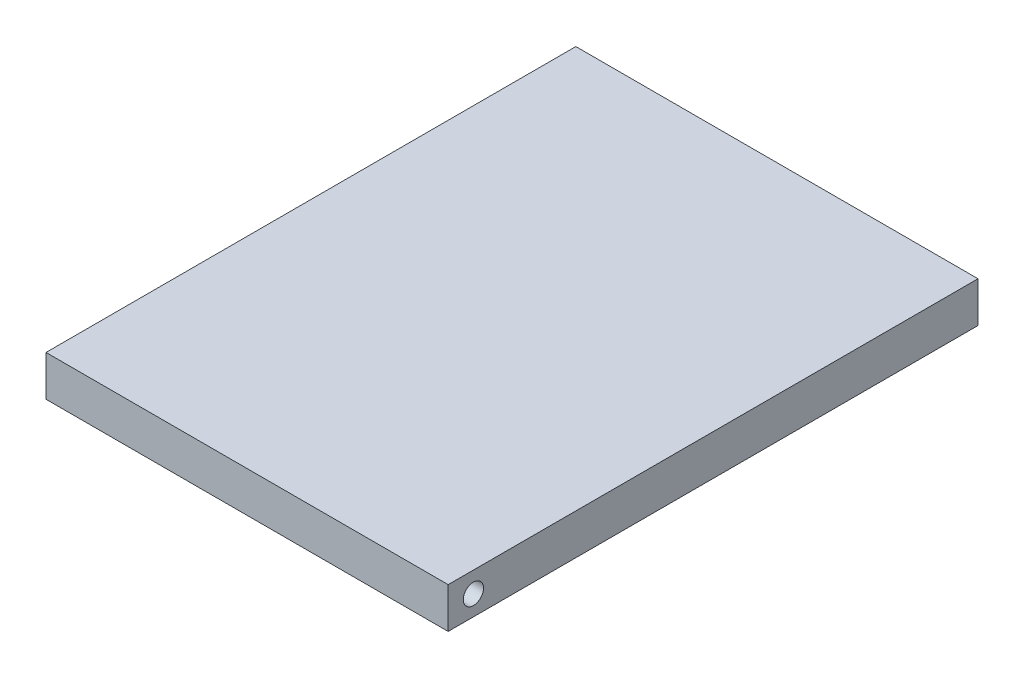
ISO-10303-21;
HEADER;
FILE_DESCRIPTION(('STEP AP214'),'2;1');
FILE_NAME('part.step','',(''),(''),'','','');
FILE_SCHEMA(('AUTOMOTIVE_DESIGN { 1 0 10303 214 1 1 1 1 }'));
ENDSEC;
DATA;
#1=APPLICATION_CONTEXT('core data for automotive mechanical design processes');
#2=APPLICATION_PROTOCOL_DEFINITION('international standard','automotive_design',2000,#1);
#3=PRODUCT_CONTEXT('',#1,'mechanical');
#4=PRODUCT('Part','Part','',(#3));
#5=PRODUCT_RELATED_PRODUCT_CATEGORY('part','',(#4));
#6=PRODUCT_DEFINITION_FORMATION('','',#4);
#7=PRODUCT_DEFINITION_CONTEXT('part definition',#1,'design');
#8=PRODUCT_DEFINITION('design','',#6,#7);
#9=PRODUCT_DEFINITION_SHAPE('','',#8);
#10=(LENGTH_UNIT() NAMED_UNIT(*) SI_UNIT(.MILLI.,.METRE.));
#11=(NAMED_UNIT(*) PLANE_ANGLE_UNIT() SI_UNIT($,.RADIAN.));
#12=(NAMED_UNIT(*) SI_UNIT($,.STERADIAN.) SOLID_ANGLE_UNIT());
#13=UNCERTAINTY_MEASURE_WITH_UNIT(LENGTH_MEASURE(1.E-05),#10,'distance_accuracy_value','');
#14=(GEOMETRIC_REPRESENTATION_CONTEXT(3) GLOBAL_UNCERTAINTY_ASSIGNED_CONTEXT((#13)) GLOBAL_UNIT_ASSIGNED_CONTEXT((#10,
#11,#12)) REPRESENTATION_CONTEXT('',''));
#15=CARTESIAN_POINT('',(0.,0.,0.));
#16=DIRECTION('',(0.,0.,1.));
#17=DIRECTION('',(1.,0.,0.));
#18=AXIS2_PLACEMENT_3D('',#15,#16,#17);
#19=CARTESIAN_POINT('',(14.87381282528,3.,-19.5956581666387));
#20=DIRECTION('',(0.,0.,1.));
#21=DIRECTION('',(1.,0.,0.));
#22=AXIS2_PLACEMENT_3D('',#19,#20,#21);
#23=PLANE('',#22);
#24=DIRECTION('',(-1.,0.,0.));
#25=VECTOR('',#24,1.);
#26=CARTESIAN_POINT('',(14.87381282528,0.,-19.5956581666387));
#27=LINE('',#26,#25);
#28=CARTESIAN_POINT('',(14.87381282528,0.,-19.5956581666387));
#29=VERTEX_POINT('',#28);
#30=CARTESIAN_POINT('',(-14.87381282528,0.,-19.5956581666387));
#31=VERTEX_POINT('',#30);
#32=EDGE_CURVE('E105',#29,#31,#27,.T.);
#33=ORIENTED_EDGE('',*,*,#32,.T.);
#34=DIRECTION('',(0.,-1.,0.));
#35=VECTOR('',#34,1.);
#36=CARTESIAN_POINT('',(-14.87381282528,3.,-19.5956581666387));
#37=LINE('',#36,#35);
#38=CARTESIAN_POINT('',(-14.87381282528,3.,-19.5956581666387));
#39=VERTEX_POINT('',#38);
#40=EDGE_CURVE('E11',#39,#31,#37,.T.);
#41=ORIENTED_EDGE('',*,*,#40,.F.);
#42=DIRECTION('',(-1.,0.,0.));
#43=VECTOR('',#42,1.);
#44=CARTESIAN_POINT('',(14.87381282528,3.,-19.5956581666387));
#45=LINE('',#44,#43);
#46=CARTESIAN_POINT('',(14.87381282528,3.,-19.5956581666387));
#47=VERTEX_POINT('',#46);
#48=EDGE_CURVE('E78',#47,#39,#45,.T.);
#49=ORIENTED_EDGE('',*,*,#48,.F.);
#50=DIRECTION('',(0.,-1.,0.));
#51=VECTOR('',#50,1.);
#52=CARTESIAN_POINT('',(14.87381282528,3.,-19.5956581666387));
#53=LINE('',#52,#51);
#54=EDGE_CURVE('E101',#47,#29,#53,.T.);
#55=ORIENTED_EDGE('',*,*,#54,.T.);
#56=EDGE_LOOP('',(#33,#41,#49,#55));
#57=FACE_BOUND('',#56,.T.);
#58=ADVANCED_FACE('F38',(#57),#23,.F.);
#59=CARTESIAN_POINT('',(-14.87381282528,3.,19.5956581666387));
#60=DIRECTION('',(-1.,0.,0.));
#61=DIRECTION('',(0.,0.,1.));
#62=AXIS2_PLACEMENT_3D('',#59,#60,#61);
#63=PLANE('',#62);
#64=DIRECTION('',(0.,0.,-1.));
#65=VECTOR('',#64,1.);
#66=CARTESIAN_POINT('',(-14.87381282528,0.,19.5956581666387));
#67=LINE('',#66,#65);
#68=CARTESIAN_POINT('',(-14.87381282528,0.,19.5956581666387));
#69=VERTEX_POINT('',#68);
#70=EDGE_CURVE('E87',#69,#31,#67,.T.);
#71=ORIENTED_EDGE('',*,*,#70,.F.);
#72=DIRECTION('',(0.,-1.,0.));
#73=VECTOR('',#72,1.);
#74=CARTESIAN_POINT('',(-14.87381282528,3.,19.5956581666387));
#75=LINE('',#74,#73);
#76=CARTESIAN_POINT('',(-14.87381282528,3.,19.5956581666387));
#77=VERTEX_POINT('',#76);
#78=EDGE_CURVE('E47',#77,#69,#75,.T.);
#79=ORIENTED_EDGE('',*,*,#78,.F.);
#80=DIRECTION('',(0.,0.,-1.));
#81=VECTOR('',#80,1.);
#82=CARTESIAN_POINT('',(-14.87381282528,3.,19.5956581666387));
#83=LINE('',#82,#81);
#84=EDGE_CURVE('E85',#77,#39,#83,.T.);
#85=ORIENTED_EDGE('',*,*,#84,.T.);
#86=ORIENTED_EDGE('',*,*,#40,.T.);
#87=EDGE_LOOP('',(#71,#79,#85,#86));
#88=FACE_BOUND('',#87,.T.);
#89=ADVANCED_FACE('F84',(#88),#63,.T.);
#90=CARTESIAN_POINT('',(14.87381282528,3.,19.5956581666387));
#91=DIRECTION('',(0.,0.,1.));
#92=DIRECTION('',(1.,0.,0.));
#93=AXIS2_PLACEMENT_3D('',#90,#91,#92);
#94=PLANE('',#93);
#95=DIRECTION('',(-1.,0.,0.));
#96=VECTOR('',#95,1.);
#97=CARTESIAN_POINT('',(14.87381282528,0.,19.5956581666387));
#98=LINE('',#97,#96);
#99=CARTESIAN_POINT('',(14.87381282528,0.,19.5956581666387));
#100=VERTEX_POINT('',#99);
#101=EDGE_CURVE('E112',#100,#69,#98,.T.);
#102=ORIENTED_EDGE('',*,*,#101,.F.);
#103=DIRECTION('',(0.,-1.,0.));
#104=VECTOR('',#103,1.);
#105=CARTESIAN_POINT('',(14.87381282528,3.,19.5956581666387));
#106=LINE('',#105,#104);
#107=CARTESIAN_POINT('',(14.87381282528,3.,19.5956581666387));
#108=VERTEX_POINT('',#107);
#109=EDGE_CURVE('E70',#108,#100,#106,.T.);
#110=ORIENTED_EDGE('',*,*,#109,.F.);
#111=DIRECTION('',(-1.,0.,0.));
#112=VECTOR('',#111,1.);
#113=CARTESIAN_POINT('',(14.87381282528,3.,19.5956581666387));
#114=LINE('',#113,#112);
#115=EDGE_CURVE('E94',#108,#77,#114,.T.);
#116=ORIENTED_EDGE('',*,*,#115,.T.);
#117=ORIENTED_EDGE('',*,*,#78,.T.);
#118=EDGE_LOOP('',(#102,#110,#116,#117));
#119=FACE_BOUND('',#118,.T.);
#120=ADVANCED_FACE('F97',(#119),#94,.T.);
#121=CARTESIAN_POINT('',(14.87381282528,3.,19.5956581666387));
#122=DIRECTION('',(-1.,0.,0.));
#123=DIRECTION('',(0.,0.,1.));
#124=AXIS2_PLACEMENT_3D('',#121,#122,#123);
#125=PLANE('',#124);
#126=CARTESIAN_POINT('',(14.87381282528,1.47679927875149,17.7277636986124));
#127=DIRECTION('',(1.,0.,0.));
#128=DIRECTION('',(0.,0.,-1.));
#129=AXIS2_PLACEMENT_3D('',#126,#127,#128);
#130=CIRCLE('',#129,0.750000000000002);
#131=CARTESIAN_POINT('',(14.87381282528,1.47679927875149,16.9777636986124));
#132=VERTEX_POINT('',#131);
#133=EDGE_CURVE('E152',#132,#132,#130,.T.);
#134=ORIENTED_EDGE('',*,*,#133,.F.);
#135=EDGE_LOOP('',(#134));
#136=FACE_BOUND('',#135,.T.);
#137=DIRECTION('',(0.,0.,-1.));
#138=VECTOR('',#137,1.);
#139=CARTESIAN_POINT('',(14.87381282528,0.,19.5956581666387));
#140=LINE('',#139,#138);
#141=EDGE_CURVE('E73',#100,#29,#140,.T.);
#142=ORIENTED_EDGE('',*,*,#141,.T.);
#143=ORIENTED_EDGE('',*,*,#54,.F.);
#144=DIRECTION('',(0.,0.,-1.));
#145=VECTOR('',#144,1.);
#146=CARTESIAN_POINT('',(14.87381282528,3.,19.5956581666387));
#147=LINE('',#146,#145);
#148=EDGE_CURVE('E55',#108,#47,#147,.T.);
#149=ORIENTED_EDGE('',*,*,#148,.F.);
#150=ORIENTED_EDGE('',*,*,#109,.T.);
#151=EDGE_LOOP('',(#142,#143,#149,#150));
#152=FACE_BOUND('',#151,.T.);
#153=ADVANCED_FACE('F134',(#136,#152),#125,.F.);
#154=CARTESIAN_POINT('',(0.,3.,0.));
#155=DIRECTION('',(0.,-1.,0.));
#156=DIRECTION('',(0.,0.,-1.));
#157=AXIS2_PLACEMENT_3D('',#154,#155,#156);
#158=PLANE('',#157);
#159=ORIENTED_EDGE('',*,*,#48,.T.);
#160=ORIENTED_EDGE('',*,*,#84,.F.);
#161=ORIENTED_EDGE('',*,*,#115,.F.);
#162=ORIENTED_EDGE('',*,*,#148,.T.);
#163=EDGE_LOOP('',(#159,#160,#161,#162));
#164=FACE_BOUND('',#163,.T.);
#165=ADVANCED_FACE('F93',(#164),#158,.F.);
#166=CARTESIAN_POINT('',(0.,0.,0.));
#167=DIRECTION('',(0.,-1.,0.));
#168=DIRECTION('',(0.,0.,-1.));
#169=AXIS2_PLACEMENT_3D('',#166,#167,#168);
#170=PLANE('',#169);
#171=ORIENTED_EDGE('',*,*,#32,.F.);
#172=ORIENTED_EDGE('',*,*,#141,.F.);
#173=ORIENTED_EDGE('',*,*,#101,.T.);
#174=ORIENTED_EDGE('',*,*,#70,.T.);
#175=EDGE_LOOP('',(#171,#172,#173,#174));
#176=FACE_BOUND('',#175,.T.);
#177=ADVANCED_FACE('F123',(#176),#170,.T.);
#178=CARTESIAN_POINT('',(1.87381282528,1.47679927875149,17.7277636986124));
#179=DIRECTION('',(1.,0.,0.));
#180=DIRECTION('',(0.,0.,-1.));
#181=AXIS2_PLACEMENT_3D('',#178,#179,#180);
#182=CYLINDRICAL_SURFACE('',#181,0.750000000000002);
#183=CARTESIAN_POINT('',(1.87381282528,1.47679927875149,17.7277636986124));
#184=DIRECTION('',(1.,0.,0.));
#185=DIRECTION('',(0.,0.,-1.));
#186=AXIS2_PLACEMENT_3D('',#183,#184,#185);
#187=CIRCLE('',#186,0.750000000000002);
#188=CARTESIAN_POINT('',(1.87381282528,1.47679927875149,16.9777636986124));
#189=VERTEX_POINT('',#188);
#190=EDGE_CURVE('E109',#189,#189,#187,.T.);
#191=ORIENTED_EDGE('',*,*,#190,.F.);
#192=EDGE_LOOP('',(#191));
#193=FACE_BOUND('',#192,.T.);
#194=ORIENTED_EDGE('',*,*,#133,.T.);
#195=EDGE_LOOP('',(#194));
#196=FACE_BOUND('',#195,.T.);
#197=ADVANCED_FACE('F125',(#193,#196),#182,.F.);
#198=CARTESIAN_POINT('',(1.87381282528,1.47679927875149,17.7277636986124));
#199=DIRECTION('',(1.,0.,0.));
#200=DIRECTION('',(0.,0.,-1.));
#201=AXIS2_PLACEMENT_3D('',#198,#199,#200);
#202=PLANE('',#201);
#203=ORIENTED_EDGE('',*,*,#190,.T.);
#204=EDGE_LOOP('',(#203));
#205=FACE_BOUND('',#204,.T.);
#206=ADVANCED_FACE('F131',(#205),#202,.T.);
#207=CLOSED_SHELL('',(#58,#89,#120,#153,#165,#177,#197,#206));
#208=MANIFOLD_SOLID_BREP('B2',#207);
#209=ADVANCED_BREP_SHAPE_REPRESENTATION('',(#18,#208),#14);
#210=SHAPE_DEFINITION_REPRESENTATION(#9,#209);
ENDSEC;
END-ISO-10303-21;
